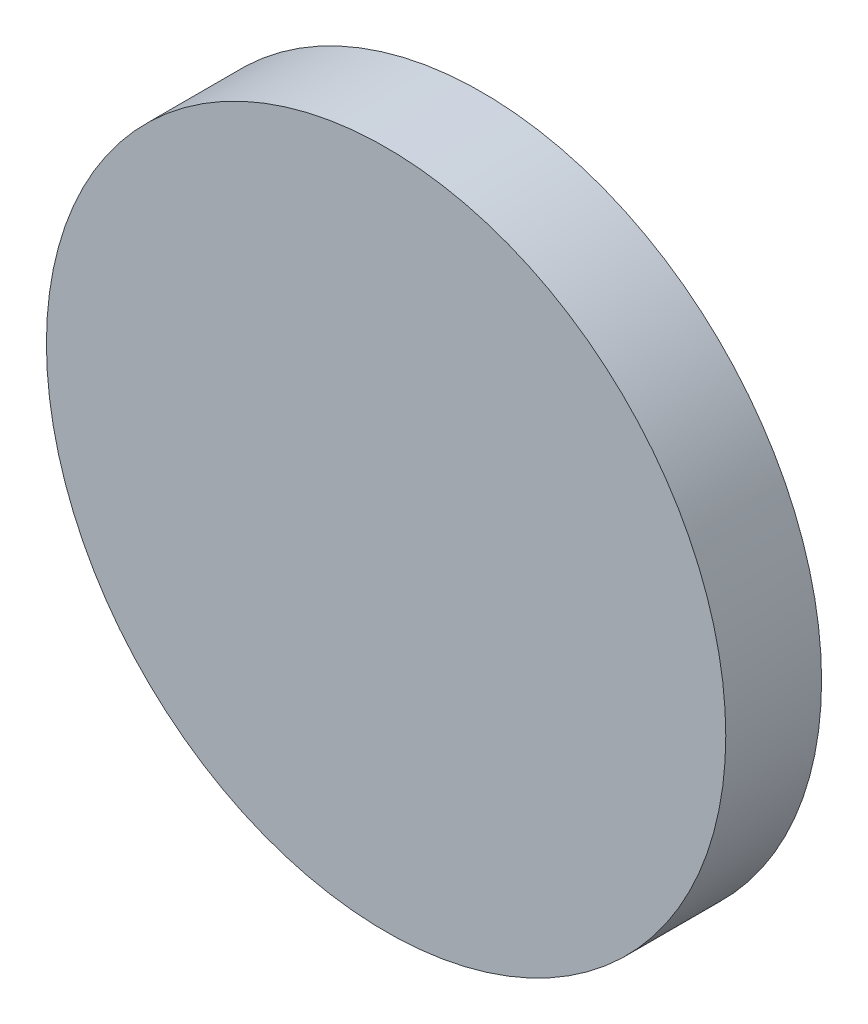
ISO-10303-21;
HEADER;
FILE_DESCRIPTION(('STEP AP214'),'2;1');
FILE_NAME('part.step','',(''),(''),'','','');
FILE_SCHEMA(('AUTOMOTIVE_DESIGN { 1 0 10303 214 1 1 1 1 }'));
ENDSEC;
DATA;
#1=APPLICATION_CONTEXT('core data for automotive mechanical design processes');
#2=APPLICATION_PROTOCOL_DEFINITION('international standard','automotive_design',2000,#1);
#3=PRODUCT_CONTEXT('',#1,'mechanical');
#4=PRODUCT('Part','Part','',(#3));
#5=PRODUCT_RELATED_PRODUCT_CATEGORY('part','',(#4));
#6=PRODUCT_DEFINITION_FORMATION('','',#4);
#7=PRODUCT_DEFINITION_CONTEXT('part definition',#1,'design');
#8=PRODUCT_DEFINITION('design','',#6,#7);
#9=PRODUCT_DEFINITION_SHAPE('','',#8);
#10=(LENGTH_UNIT() NAMED_UNIT(*) SI_UNIT(.MILLI.,.METRE.));
#11=(NAMED_UNIT(*) PLANE_ANGLE_UNIT() SI_UNIT($,.RADIAN.));
#12=(NAMED_UNIT(*) SI_UNIT($,.STERADIAN.) SOLID_ANGLE_UNIT());
#13=UNCERTAINTY_MEASURE_WITH_UNIT(LENGTH_MEASURE(1.E-05),#10,'distance_accuracy_value','');
#14=(GEOMETRIC_REPRESENTATION_CONTEXT(3) GLOBAL_UNCERTAINTY_ASSIGNED_CONTEXT((#13)) GLOBAL_UNIT_ASSIGNED_CONTEXT((#10,
#11,#12)) REPRESENTATION_CONTEXT('',''));
#15=CARTESIAN_POINT('',(0.,0.,0.));
#16=DIRECTION('',(0.,0.,1.));
#17=DIRECTION('',(1.,0.,0.));
#18=AXIS2_PLACEMENT_3D('',#15,#16,#17);
#19=CARTESIAN_POINT('',(0.,0.,10.));
#20=DIRECTION('',(0.,0.,-1.));
#21=DIRECTION('',(-1.,0.,0.));
#22=AXIS2_PLACEMENT_3D('',#19,#20,#21);
#23=CYLINDRICAL_SURFACE('',#22,35.4558129025971);
#24=CARTESIAN_POINT('',(0.,0.,10.));
#25=DIRECTION('',(0.,0.,1.));
#26=DIRECTION('',(1.,0.,0.));
#27=AXIS2_PLACEMENT_3D('',#24,#25,#26);
#28=CIRCLE('',#27,35.4558129025971);
#29=CARTESIAN_POINT('',(35.4558129025971,0.,10.));
#30=VERTEX_POINT('',#29);
#31=EDGE_CURVE('E10',#30,#30,#28,.T.);
#32=ORIENTED_EDGE('',*,*,#31,.F.);
#33=EDGE_LOOP('',(#32));
#34=FACE_BOUND('',#33,.T.);
#35=CARTESIAN_POINT('',(0.,0.,0.));
#36=DIRECTION('',(0.,0.,1.));
#37=DIRECTION('',(1.,0.,0.));
#38=AXIS2_PLACEMENT_3D('',#35,#36,#37);
#39=CIRCLE('',#38,35.4558129025971);
#40=CARTESIAN_POINT('',(35.4558129025971,0.,0.));
#41=VERTEX_POINT('',#40);
#42=EDGE_CURVE('E36',#41,#41,#39,.T.);
#43=ORIENTED_EDGE('',*,*,#42,.T.);
#44=EDGE_LOOP('',(#43));
#45=FACE_BOUND('',#44,.T.);
#46=ADVANCED_FACE('F33',(#34,#45),#23,.T.);
#47=CARTESIAN_POINT('',(0.,0.,10.));
#48=DIRECTION('',(0.,0.,1.));
#49=DIRECTION('',(1.,0.,0.));
#50=AXIS2_PLACEMENT_3D('',#47,#48,#49);
#51=PLANE('',#50);
#52=ORIENTED_EDGE('',*,*,#31,.T.);
#53=EDGE_LOOP('',(#52));
#54=FACE_BOUND('',#53,.T.);
#55=ADVANCED_FACE('F48',(#54),#51,.T.);
#56=CARTESIAN_POINT('',(0.,0.,0.));
#57=DIRECTION('',(0.,0.,1.));
#58=DIRECTION('',(1.,0.,0.));
#59=AXIS2_PLACEMENT_3D('',#56,#57,#58);
#60=PLANE('',#59);
#61=ORIENTED_EDGE('',*,*,#42,.F.);
#62=EDGE_LOOP('',(#61));
#63=FACE_BOUND('',#62,.T.);
#64=ADVANCED_FACE('F46',(#63),#60,.F.);
#65=CLOSED_SHELL('',(#46,#55,#64));
#66=MANIFOLD_SOLID_BREP('B2',#65);
#67=ADVANCED_BREP_SHAPE_REPRESENTATION('',(#18,#66),#14);
#68=SHAPE_DEFINITION_REPRESENTATION(#9,#67);
ENDSEC;
END-ISO-10303-21;
